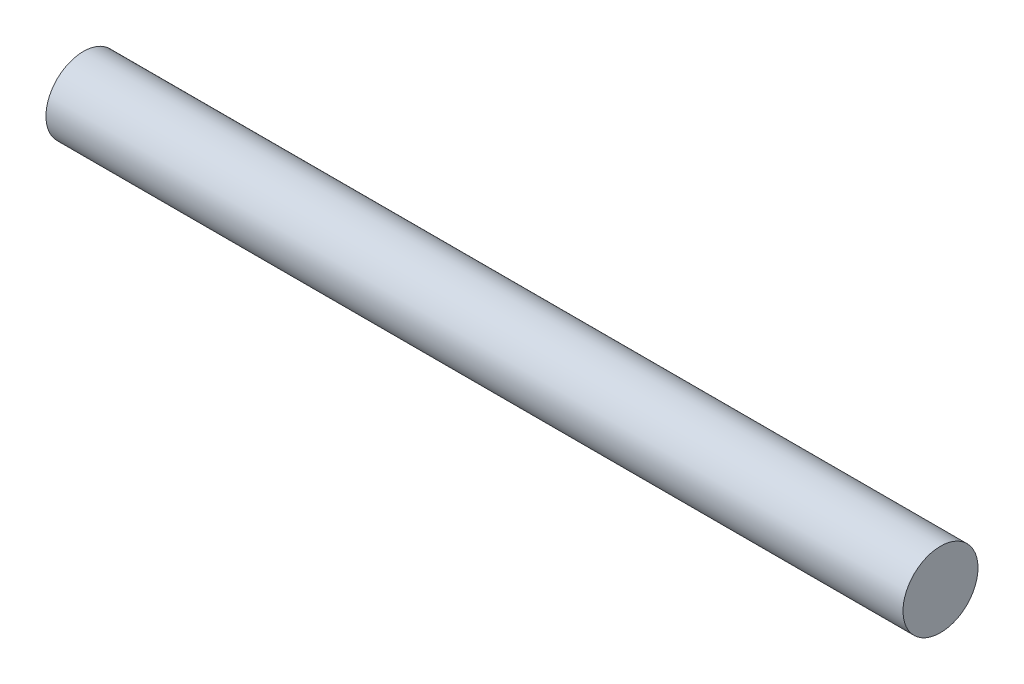
ISO-10303-21;
HEADER;
FILE_DESCRIPTION(('STEP AP214'),'2;1');
FILE_NAME('part.step','',(''),(''),'','','');
FILE_SCHEMA(('AUTOMOTIVE_DESIGN { 1 0 10303 214 1 1 1 1 }'));
ENDSEC;
DATA;
#1=APPLICATION_CONTEXT('core data for automotive mechanical design processes');
#2=APPLICATION_PROTOCOL_DEFINITION('international standard','automotive_design',2000,#1);
#3=PRODUCT_CONTEXT('',#1,'mechanical');
#4=PRODUCT('Part','Part','',(#3));
#5=PRODUCT_RELATED_PRODUCT_CATEGORY('part','',(#4));
#6=PRODUCT_DEFINITION_FORMATION('','',#4);
#7=PRODUCT_DEFINITION_CONTEXT('part definition',#1,'design');
#8=PRODUCT_DEFINITION('design','',#6,#7);
#9=PRODUCT_DEFINITION_SHAPE('','',#8);
#10=(LENGTH_UNIT() NAMED_UNIT(*) SI_UNIT(.MILLI.,.METRE.));
#11=(NAMED_UNIT(*) PLANE_ANGLE_UNIT() SI_UNIT($,.RADIAN.));
#12=(NAMED_UNIT(*) SI_UNIT($,.STERADIAN.) SOLID_ANGLE_UNIT());
#13=UNCERTAINTY_MEASURE_WITH_UNIT(LENGTH_MEASURE(1.E-05),#10,'distance_accuracy_value','');
#14=(GEOMETRIC_REPRESENTATION_CONTEXT(3) GLOBAL_UNCERTAINTY_ASSIGNED_CONTEXT((#13)) GLOBAL_UNIT_ASSIGNED_CONTEXT((#10,
#11,#12)) REPRESENTATION_CONTEXT('',''));
#15=CARTESIAN_POINT('',(0.,0.,0.));
#16=DIRECTION('',(0.,0.,1.));
#17=DIRECTION('',(1.,0.,0.));
#18=AXIS2_PLACEMENT_3D('',#15,#16,#17);
#19=CARTESIAN_POINT('',(80.,0.,0.));
#20=DIRECTION('',(-1.,0.,0.));
#21=DIRECTION('',(0.,0.,1.));
#22=AXIS2_PLACEMENT_3D('',#19,#20,#21);
#23=CYLINDRICAL_SURFACE('',#22,3.5);
#24=CARTESIAN_POINT('',(80.,0.,0.));
#25=DIRECTION('',(1.,0.,0.));
#26=DIRECTION('',(0.,0.,-1.));
#27=AXIS2_PLACEMENT_3D('',#24,#25,#26);
#28=CIRCLE('',#27,3.5);
#29=CARTESIAN_POINT('',(80.,0.,-3.5));
#30=VERTEX_POINT('',#29);
#31=EDGE_CURVE('E10',#30,#30,#28,.T.);
#32=ORIENTED_EDGE('',*,*,#31,.F.);
#33=EDGE_LOOP('',(#32));
#34=FACE_BOUND('',#33,.T.);
#35=CARTESIAN_POINT('',(0.,0.,0.));
#36=DIRECTION('',(1.,0.,0.));
#37=DIRECTION('',(0.,0.,-1.));
#38=AXIS2_PLACEMENT_3D('',#35,#36,#37);
#39=CIRCLE('',#38,3.5);
#40=CARTESIAN_POINT('',(0.,0.,-3.5));
#41=VERTEX_POINT('',#40);
#42=EDGE_CURVE('E34',#41,#41,#39,.T.);
#43=ORIENTED_EDGE('',*,*,#42,.T.);
#44=EDGE_LOOP('',(#43));
#45=FACE_BOUND('',#44,.T.);
#46=ADVANCED_FACE('F31',(#34,#45),#23,.T.);
#47=CARTESIAN_POINT('',(80.,0.,0.));
#48=DIRECTION('',(1.,0.,0.));
#49=DIRECTION('',(0.,0.,-1.));
#50=AXIS2_PLACEMENT_3D('',#47,#48,#49);
#51=PLANE('',#50);
#52=ORIENTED_EDGE('',*,*,#31,.T.);
#53=EDGE_LOOP('',(#52));
#54=FACE_BOUND('',#53,.T.);
#55=ADVANCED_FACE('F46',(#54),#51,.T.);
#56=CARTESIAN_POINT('',(0.,0.,0.));
#57=DIRECTION('',(1.,0.,0.));
#58=DIRECTION('',(0.,0.,-1.));
#59=AXIS2_PLACEMENT_3D('',#56,#57,#58);
#60=PLANE('',#59);
#61=ORIENTED_EDGE('',*,*,#42,.F.);
#62=EDGE_LOOP('',(#61));
#63=FACE_BOUND('',#62,.T.);
#64=ADVANCED_FACE('F44',(#63),#60,.F.);
#65=CLOSED_SHELL('',(#46,#55,#64));
#66=MANIFOLD_SOLID_BREP('B2',#65);
#67=ADVANCED_BREP_SHAPE_REPRESENTATION('',(#18,#66),#14);
#68=SHAPE_DEFINITION_REPRESENTATION(#9,#67);
ENDSEC;
END-ISO-10303-21;
